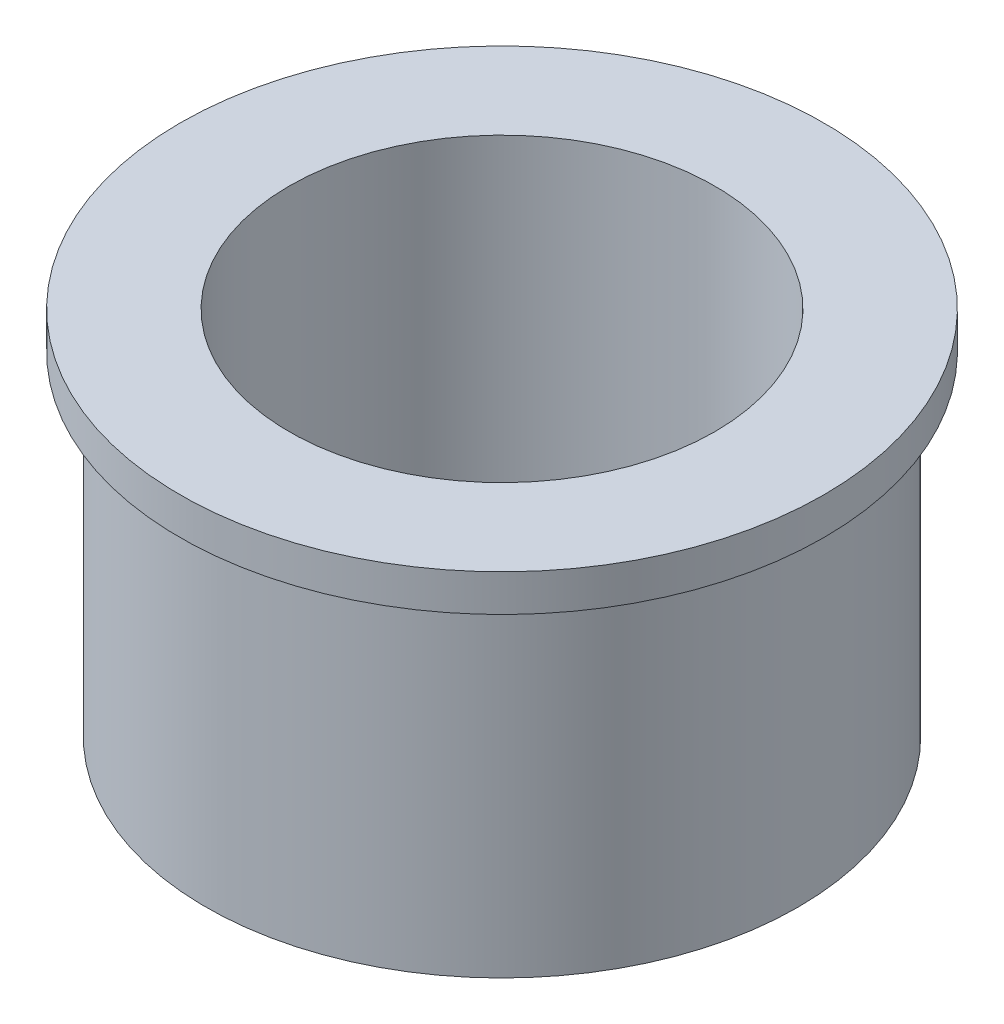
ISO-10303-21;
HEADER;
FILE_DESCRIPTION(('STEP AP214'),'2;1');
FILE_NAME('part.step','',(''),(''),'','','');
FILE_SCHEMA(('AUTOMOTIVE_DESIGN { 1 0 10303 214 1 1 1 1 }'));
ENDSEC;
DATA;
#1=APPLICATION_CONTEXT('core data for automotive mechanical design processes');
#2=APPLICATION_PROTOCOL_DEFINITION('international standard','automotive_design',2000,#1);
#3=PRODUCT_CONTEXT('',#1,'mechanical');
#4=PRODUCT('Part','Part','',(#3));
#5=PRODUCT_RELATED_PRODUCT_CATEGORY('part','',(#4));
#6=PRODUCT_DEFINITION_FORMATION('','',#4);
#7=PRODUCT_DEFINITION_CONTEXT('part definition',#1,'design');
#8=PRODUCT_DEFINITION('design','',#6,#7);
#9=PRODUCT_DEFINITION_SHAPE('','',#8);
#10=(LENGTH_UNIT() NAMED_UNIT(*) SI_UNIT(.MILLI.,.METRE.));
#11=(NAMED_UNIT(*) PLANE_ANGLE_UNIT() SI_UNIT($,.RADIAN.));
#12=(NAMED_UNIT(*) SI_UNIT($,.STERADIAN.) SOLID_ANGLE_UNIT());
#13=UNCERTAINTY_MEASURE_WITH_UNIT(LENGTH_MEASURE(1.E-05),#10,'distance_accuracy_value','');
#14=(GEOMETRIC_REPRESENTATION_CONTEXT(3) GLOBAL_UNCERTAINTY_ASSIGNED_CONTEXT((#13)) GLOBAL_UNIT_ASSIGNED_CONTEXT((#10,
#11,#12)) REPRESENTATION_CONTEXT('',''));
#15=CARTESIAN_POINT('',(0.,0.,0.));
#16=DIRECTION('',(0.,0.,1.));
#17=DIRECTION('',(1.,0.,0.));
#18=AXIS2_PLACEMENT_3D('',#15,#16,#17);
#19=CARTESIAN_POINT('',(0.,0.5,0.));
#20=DIRECTION('',(0.,-1.,0.));
#21=DIRECTION('',(-1.,0.,0.));
#22=AXIS2_PLACEMENT_3D('',#19,#20,#21);
#23=CYLINDRICAL_SURFACE('',#22,5.75);
#24=CARTESIAN_POINT('',(0.,-10.,0.));
#25=DIRECTION('',(0.,-1.,0.));
#26=DIRECTION('',(1.,0.,0.));
#27=AXIS2_PLACEMENT_3D('',#24,#25,#26);
#28=CIRCLE('',#27,5.75);
#29=CARTESIAN_POINT('',(5.75,-10.,0.));
#30=VERTEX_POINT('',#29);
#31=EDGE_CURVE('E10',#30,#30,#28,.T.);
#32=ORIENTED_EDGE('',*,*,#31,.T.);
#33=EDGE_LOOP('',(#32));
#34=FACE_BOUND('',#33,.T.);
#35=CARTESIAN_POINT('',(0.,0.,0.));
#36=DIRECTION('',(0.,-1.,0.));
#37=DIRECTION('',(1.,0.,0.));
#38=AXIS2_PLACEMENT_3D('',#35,#36,#37);
#39=CIRCLE('',#38,5.75);
#40=CARTESIAN_POINT('',(5.75,0.,0.));
#41=VERTEX_POINT('',#40);
#42=EDGE_CURVE('E31',#41,#41,#39,.T.);
#43=ORIENTED_EDGE('',*,*,#42,.F.);
#44=EDGE_LOOP('',(#43));
#45=FACE_BOUND('',#44,.T.);
#46=ADVANCED_FACE('F15',(#34,#45),#23,.F.);
#47=CARTESIAN_POINT('',(0.,-10.,0.));
#48=DIRECTION('',(0.,-1.,0.));
#49=DIRECTION('',(-1.,0.,0.));
#50=AXIS2_PLACEMENT_3D('',#47,#48,#49);
#51=PLANE('',#50);
#52=CARTESIAN_POINT('',(0.,-10.,0.));
#53=DIRECTION('',(0.,1.,0.));
#54=DIRECTION('',(1.,0.,0.));
#55=AXIS2_PLACEMENT_3D('',#52,#53,#54);
#56=CIRCLE('',#55,8.);
#57=CARTESIAN_POINT('',(8.,-10.,0.));
#58=VERTEX_POINT('',#57);
#59=EDGE_CURVE('E28',#58,#58,#56,.T.);
#60=ORIENTED_EDGE('',*,*,#59,.F.);
#61=EDGE_LOOP('',(#60));
#62=FACE_BOUND('',#61,.T.);
#63=ORIENTED_EDGE('',*,*,#31,.F.);
#64=EDGE_LOOP('',(#63));
#65=FACE_BOUND('',#64,.T.);
#66=ADVANCED_FACE('F49',(#62,#65),#51,.T.);
#67=CARTESIAN_POINT('',(0.,0.5,0.));
#68=DIRECTION('',(0.,-1.,0.));
#69=DIRECTION('',(-1.,0.,0.));
#70=AXIS2_PLACEMENT_3D('',#67,#68,#69);
#71=CYLINDRICAL_SURFACE('',#70,8.);
#72=CARTESIAN_POINT('',(0.,-1.,0.));
#73=DIRECTION('',(0.,-1.,0.));
#74=DIRECTION('',(1.,0.,0.));
#75=AXIS2_PLACEMENT_3D('',#72,#73,#74);
#76=CIRCLE('',#75,8.);
#77=CARTESIAN_POINT('',(8.,-1.,0.));
#78=VERTEX_POINT('',#77);
#79=EDGE_CURVE('E23',#78,#78,#76,.T.);
#80=ORIENTED_EDGE('',*,*,#79,.T.);
#81=EDGE_LOOP('',(#80));
#82=FACE_BOUND('',#81,.T.);
#83=ORIENTED_EDGE('',*,*,#59,.T.);
#84=EDGE_LOOP('',(#83));
#85=FACE_BOUND('',#84,.T.);
#86=ADVANCED_FACE('F55',(#82,#85),#71,.T.);
#87=CARTESIAN_POINT('',(0.,-1.,0.));
#88=DIRECTION('',(0.,-1.,0.));
#89=DIRECTION('',(-1.,0.,0.));
#90=AXIS2_PLACEMENT_3D('',#87,#88,#89);
#91=PLANE('',#90);
#92=CARTESIAN_POINT('',(0.,-1.,0.));
#93=DIRECTION('',(0.,1.,0.));
#94=DIRECTION('',(1.,0.,0.));
#95=AXIS2_PLACEMENT_3D('',#92,#93,#94);
#96=CIRCLE('',#95,8.7);
#97=CARTESIAN_POINT('',(8.7,-1.,0.));
#98=VERTEX_POINT('',#97);
#99=EDGE_CURVE('E34',#98,#98,#96,.T.);
#100=ORIENTED_EDGE('',*,*,#99,.F.);
#101=EDGE_LOOP('',(#100));
#102=FACE_BOUND('',#101,.T.);
#103=ORIENTED_EDGE('',*,*,#79,.F.);
#104=EDGE_LOOP('',(#103));
#105=FACE_BOUND('',#104,.T.);
#106=ADVANCED_FACE('F61',(#102,#105),#91,.T.);
#107=CARTESIAN_POINT('',(0.,0.5,0.));
#108=DIRECTION('',(0.,-1.,0.));
#109=DIRECTION('',(-1.,0.,0.));
#110=AXIS2_PLACEMENT_3D('',#107,#108,#109);
#111=CYLINDRICAL_SURFACE('',#110,8.7);
#112=CARTESIAN_POINT('',(0.,0.,0.));
#113=DIRECTION('',(0.,-1.,0.));
#114=DIRECTION('',(1.,0.,0.));
#115=AXIS2_PLACEMENT_3D('',#112,#113,#114);
#116=CIRCLE('',#115,8.7);
#117=CARTESIAN_POINT('',(8.7,0.,0.));
#118=VERTEX_POINT('',#117);
#119=EDGE_CURVE('E19',#118,#118,#116,.T.);
#120=ORIENTED_EDGE('',*,*,#119,.T.);
#121=EDGE_LOOP('',(#120));
#122=FACE_BOUND('',#121,.T.);
#123=ORIENTED_EDGE('',*,*,#99,.T.);
#124=EDGE_LOOP('',(#123));
#125=FACE_BOUND('',#124,.T.);
#126=ADVANCED_FACE('F42',(#122,#125),#111,.T.);
#127=CARTESIAN_POINT('',(0.,0.,0.));
#128=DIRECTION('',(0.,-1.,0.));
#129=DIRECTION('',(-1.,0.,0.));
#130=AXIS2_PLACEMENT_3D('',#127,#128,#129);
#131=PLANE('',#130);
#132=ORIENTED_EDGE('',*,*,#119,.F.);
#133=EDGE_LOOP('',(#132));
#134=FACE_BOUND('',#133,.T.);
#135=ORIENTED_EDGE('',*,*,#42,.T.);
#136=EDGE_LOOP('',(#135));
#137=FACE_BOUND('',#136,.T.);
#138=ADVANCED_FACE('F17',(#134,#137),#131,.F.);
#139=CLOSED_SHELL('',(#46,#66,#86,#106,#126,#138));
#140=MANIFOLD_SOLID_BREP('B1',#139);
#141=ADVANCED_BREP_SHAPE_REPRESENTATION('',(#18,#140),#14);
#142=SHAPE_DEFINITION_REPRESENTATION(#9,#141);
ENDSEC;
END-ISO-10303-21;
